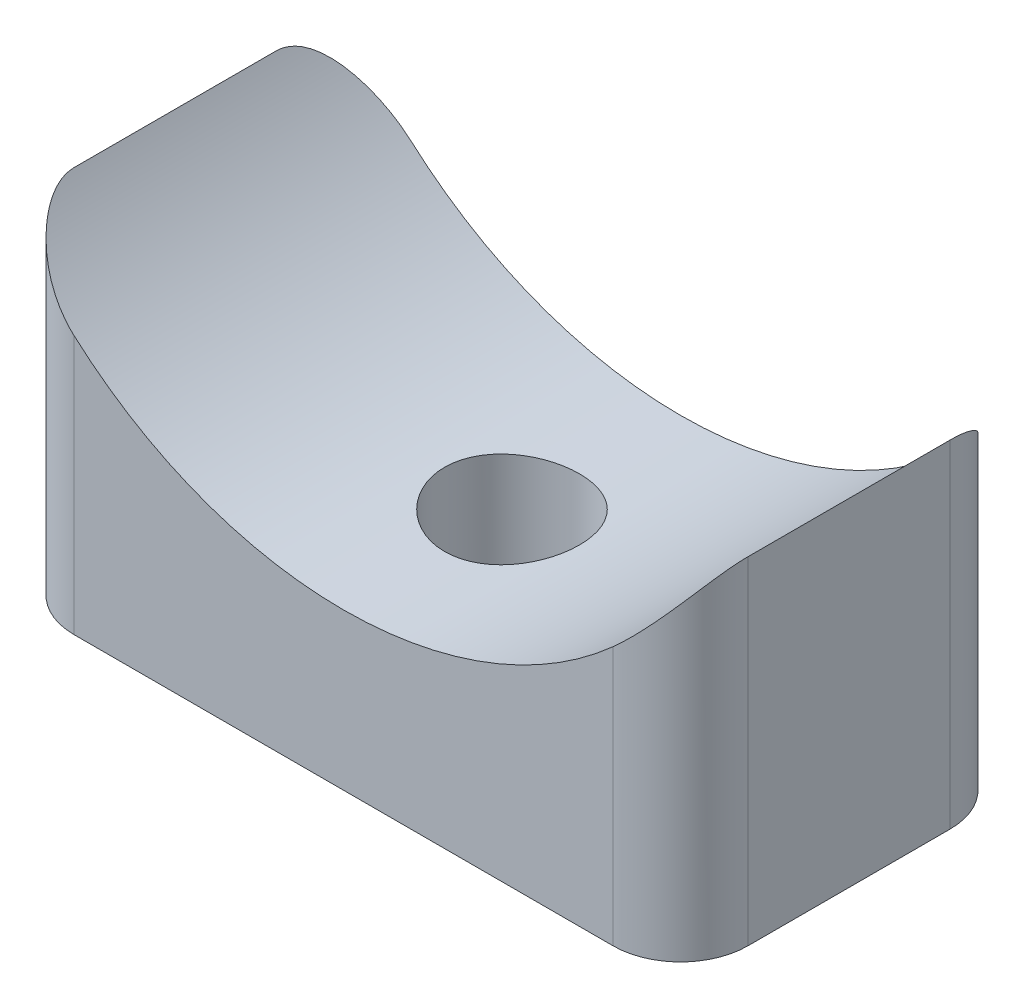
ISO-10303-21;
HEADER;
FILE_DESCRIPTION(('STEP AP214'),'2;1');
FILE_NAME('part.step','',(''),(''),'','','');
FILE_SCHEMA(('AUTOMOTIVE_DESIGN { 1 0 10303 214 1 1 1 1 }'));
ENDSEC;
DATA;
#1=APPLICATION_CONTEXT('core data for automotive mechanical design processes');
#2=APPLICATION_PROTOCOL_DEFINITION('international standard','automotive_design',2000,#1);
#3=PRODUCT_CONTEXT('',#1,'mechanical');
#4=PRODUCT('Part','Part','',(#3));
#5=PRODUCT_RELATED_PRODUCT_CATEGORY('part','',(#4));
#6=PRODUCT_DEFINITION_FORMATION('','',#4);
#7=PRODUCT_DEFINITION_CONTEXT('part definition',#1,'design');
#8=PRODUCT_DEFINITION('design','',#6,#7);
#9=PRODUCT_DEFINITION_SHAPE('','',#8);
#10=(LENGTH_UNIT() NAMED_UNIT(*) SI_UNIT(.MILLI.,.METRE.));
#11=(NAMED_UNIT(*) PLANE_ANGLE_UNIT() SI_UNIT($,.RADIAN.));
#12=(NAMED_UNIT(*) SI_UNIT($,.STERADIAN.) SOLID_ANGLE_UNIT());
#13=UNCERTAINTY_MEASURE_WITH_UNIT(LENGTH_MEASURE(1.E-05),#10,'distance_accuracy_value','');
#14=(GEOMETRIC_REPRESENTATION_CONTEXT(3) GLOBAL_UNCERTAINTY_ASSIGNED_CONTEXT((#13)) GLOBAL_UNIT_ASSIGNED_CONTEXT((#10,
#11,#12)) REPRESENTATION_CONTEXT('',''));
#15=CARTESIAN_POINT('',(0.,0.,0.));
#16=DIRECTION('',(0.,0.,1.));
#17=DIRECTION('',(1.,0.,0.));
#18=AXIS2_PLACEMENT_3D('',#15,#16,#17);
#19=CARTESIAN_POINT('',(10.,16.6332495807108,5.));
#20=DIRECTION('',(0.,0.,-1.));
#21=DIRECTION('',(-1.,0.,0.));
#22=AXIS2_PLACEMENT_3D('',#19,#20,#21);
#23=CYLINDRICAL_SURFACE('',#22,12.);
#24=CARTESIAN_POINT('',(10.,16.6332495807108,-5.));
#25=DIRECTION('',(0.,0.,1.));
#26=DIRECTION('',(1.,0.,0.));
#27=AXIS2_PLACEMENT_3D('',#24,#25,#26);
#28=CIRCLE('',#27,12.);
#29=CARTESIAN_POINT('',(2.,7.68897767071164,-5.));
#30=VERTEX_POINT('',#29);
#31=CARTESIAN_POINT('',(18.,7.68897767071164,-5.));
#32=VERTEX_POINT('',#31);
#33=EDGE_CURVE('E125',#30,#32,#28,.T.);
#34=ORIENTED_EDGE('',*,*,#33,.F.);
#35=CARTESIAN_POINT('',(2.,7.68897767071164,-5.));
#36=CARTESIAN_POINT('',(1.92204510458024,7.75868645106927,-4.99997917822242));
#37=CARTESIAN_POINT('',(1.84505077722787,7.82940191675064,-4.99544345556545));
#38=CARTESIAN_POINT('',(1.69347683524996,7.97227755145943,-4.97784777860481));
#39=CARTESIAN_POINT('',(1.61889603272118,8.04443698058889,-4.96479208680467));
#40=CARTESIAN_POINT('',(1.47186755789119,8.19039386983282,-4.93049860750971));
#41=CARTESIAN_POINT('',(1.39944694093692,8.26420038332054,-4.90918413503015));
#42=CARTESIAN_POINT('',(1.25783085906952,8.41224191582747,-4.85871940650219));
#43=CARTESIAN_POINT('',(1.18863579212429,8.48647698645884,-4.82956818654379));
#44=CARTESIAN_POINT('',(1.05321449198005,8.63542185674512,-4.76332897570576));
#45=CARTESIAN_POINT('',(0.987019224377797,8.71013018735646,-4.72617432063361));
#46=CARTESIAN_POINT('',(0.858561642931568,8.85869188623412,-4.64405982584332));
#47=CARTESIAN_POINT('',(0.796300471448964,8.93254500112933,-4.59909773312028));
#48=CARTESIAN_POINT('',(0.676386358533189,9.07817929079992,-4.50133582039084));
#49=CARTESIAN_POINT('',(0.618715689366292,9.14996767628857,-4.44856865190294));
#50=CARTESIAN_POINT('',(0.508315681273988,9.29050520845288,-4.33460422579772));
#51=CARTESIAN_POINT('',(0.455581486014663,9.35925730618198,-4.27341540271135));
#52=CARTESIAN_POINT('',(0.359678922165779,9.48691568729856,-4.14680631508015));
#53=CARTESIAN_POINT('',(0.316087563711884,9.54617290156917,-4.08206620228683));
#54=CARTESIAN_POINT('',(0.23490736936106,9.6584557601215,-3.94385681181086));
#55=CARTESIAN_POINT('',(0.197316203038635,9.71148382163172,-3.87039094257141));
#56=CARTESIAN_POINT('',(0.135602221832064,9.79979824677033,-3.72733321846744));
#57=CARTESIAN_POINT('',(0.11027653272764,9.83656832122584,-3.65919518648288));
#58=CARTESIAN_POINT('',(0.0664894778290019,9.90072561008608,-3.51676489521075));
#59=CARTESIAN_POINT('',(0.0480004595853315,9.92815058668345,-3.44249894755876));
#60=CARTESIAN_POINT('',(0.0228213116726365,9.96569411581327,-3.30710349566573));
#61=CARTESIAN_POINT('',(0.0143740844759094,9.97837282220845,-3.2470268075222));
#62=CARTESIAN_POINT('',(0.00580822302781559,9.99125020974666,-3.15541820622691));
#63=CARTESIAN_POINT('',(0.0036367271853185,9.9945198825449,-3.12448546214764));
#64=CARTESIAN_POINT('',(0.000730180679332706,9.99889910691122,-3.06237330489779));
#65=CARTESIAN_POINT('',(-3.58597037463007E-06,10.0000067275805,-3.03119369618058));
#66=CARTESIAN_POINT('',(0.,10.,-3.));
#67=B_SPLINE_CURVE_WITH_KNOTS('',3,(#35,#36,#37,#38,#39,#40,#41,#42,#43,#44,#45,#46,#47,#48,#49,
#50,#51,#52,#53,#54,#55,#56,#57,#58,#59,#60,#61,#62,#63,#64,#65,#66),.UNSPECIFIED.,.F.,.F.,(4,2,
2,2,2,2,2,2,2,2,2,2,2,2,2,4),(0.,0.313559302357869,0.626961852499961,0.943346994547067,
1.25977106938429,1.57894039976984,1.89820198689255,2.21616390009485,2.53380965162216,
2.82719398303881,3.12046408764999,3.36402803986124,3.60659577827073,3.79173317186206,
3.88517645406816,3.97870315106009),.UNSPECIFIED.);
#68=CARTESIAN_POINT('',(0.,10.,-3.));
#69=VERTEX_POINT('',#68);
#70=EDGE_CURVE('E107',#30,#69,#67,.T.);
#71=ORIENTED_EDGE('',*,*,#70,.T.);
#72=DIRECTION('',(0.,0.,-1.));
#73=VECTOR('',#72,1.);
#74=CARTESIAN_POINT('',(0.,10.,5.));
#75=LINE('',#74,#73);
#76=CARTESIAN_POINT('',(0.,10.,3.));
#77=VERTEX_POINT('',#76);
#78=EDGE_CURVE('E161',#77,#69,#75,.T.);
#79=ORIENTED_EDGE('',*,*,#78,.F.);
#80=CARTESIAN_POINT('',(0.,10.,3.));
#81=CARTESIAN_POINT('',(-4.77274501777126E-06,10.0000089682609,3.03361012386352));
#82=CARTESIAN_POINT('',(0.000847762427299819,9.99872181038443,3.06720206872265));
#83=CARTESIAN_POINT('',(0.00421949742550781,9.99364217286556,3.13407488350284));
#84=CARTESIAN_POINT('',(0.00673682701038321,9.98985250456692,3.16735606004437));
#85=CARTESIAN_POINT('',(0.0166398074990194,9.97497164198942,3.26566743854851));
#86=CARTESIAN_POINT('',(0.0263789571247845,9.96036417864577,3.32995718350108));
#87=CARTESIAN_POINT('',(0.0545861362410382,9.91837660448694,3.47094020687341));
#88=CARTESIAN_POINT('',(0.0746486923412716,9.88868655934674,3.54660534544344));
#89=CARTESIAN_POINT('',(0.121764469953672,9.81986480680978,3.69142835854605));
#90=CARTESIAN_POINT('',(0.148851091760303,9.78068804952499,3.76055292765346));
#91=CARTESIAN_POINT('',(0.224842251187709,9.67245339006089,3.92808160600015));
#92=CARTESIAN_POINT('',(0.277563114088291,9.59879496513803,4.02173906376068));
#93=CARTESIAN_POINT('',(0.392548559873376,9.44253573990624,4.1945289292063));
#94=CARTESIAN_POINT('',(0.454834503364488,9.35991504953936,4.27362793379137));
#95=CARTESIAN_POINT('',(0.572367710512135,9.20850606197209,4.4027423796056));
#96=CARTESIAN_POINT('',(0.626120281415772,9.14070508930136,4.45531967115386));
#97=CARTESIAN_POINT('',(0.737737440309093,9.00315538087289,4.55312741942334));
#98=CARTESIAN_POINT('',(0.795604160953076,8.93340564647427,4.59835402525909));
#99=CARTESIAN_POINT('',(0.915036621231506,8.79284450140155,4.68171218921222));
#100=CARTESIAN_POINT('',(0.97660279645977,8.72203296644486,4.71984290964752));
#101=CARTESIAN_POINT('',(1.10312689275757,8.58000842188343,4.78908312756059));
#102=CARTESIAN_POINT('',(1.16808483149968,8.50879541018853,4.82019258845003));
#103=CARTESIAN_POINT('',(1.29412073767458,8.37399627899815,4.87240076944587));
#104=CARTESIAN_POINT('',(1.35488984009073,8.3103945348968,4.89420767141069));
#105=CARTESIAN_POINT('',(1.47869858247348,8.18367744517249,4.93195019693017));
#106=CARTESIAN_POINT('',(1.54173781599747,8.12056201491261,4.94788686580628));
#107=CARTESIAN_POINT('',(1.66965702690738,7.99534715548048,4.9736054438867));
#108=CARTESIAN_POINT('',(1.73453059105733,7.93324515510233,4.98340655373327));
#109=CARTESIAN_POINT('',(1.86603263320305,7.81016998882577,4.99659975990954));
#110=CARTESIAN_POINT('',(1.93266195272534,7.74919738899411,4.99998872411412));
#111=CARTESIAN_POINT('',(2.,7.68897767071164,5.));
#112=B_SPLINE_CURVE_WITH_KNOTS('',3,(#80,#81,#82,#83,#84,#85,#86,#87,#88,#89,#90,#91,#92,#93,
#94,#95,#96,#97,#98,#99,#100,#101,#102,#103,#104,#105,#106,#107,#108,#109,#110,#111),
.UNSPECIFIED.,.F.,.F.,(4,2,2,2,2,2,2,2,2,2,2,2,2,2,2,4),(0.,0.100761556823339,0.201410109299858,
0.400366303973839,0.650159620433542,0.901163239521809,1.28989730972732,1.67951247049873,
1.98286822722978,2.28638239760242,2.58993237567264,2.89348393552917,3.16515944935207,
3.43678656208418,3.70755933787016,3.97846434326101),.UNSPECIFIED.);
#113=CARTESIAN_POINT('',(2.,7.68897767071164,5.));
#114=VERTEX_POINT('',#113);
#115=EDGE_CURVE('E119',#77,#114,#112,.T.);
#116=ORIENTED_EDGE('',*,*,#115,.T.);
#117=CARTESIAN_POINT('',(10.,16.6332495807108,5.));
#118=DIRECTION('',(0.,0.,1.));
#119=DIRECTION('',(1.,0.,0.));
#120=AXIS2_PLACEMENT_3D('',#117,#118,#119);
#121=CIRCLE('',#120,12.);
#122=CARTESIAN_POINT('',(18.,7.68897767071164,5.));
#123=VERTEX_POINT('',#122);
#124=EDGE_CURVE('E141',#114,#123,#121,.T.);
#125=ORIENTED_EDGE('',*,*,#124,.T.);
#126=CARTESIAN_POINT('',(18.,7.68897767071164,5.));
#127=CARTESIAN_POINT('',(18.0779548954198,7.75868645106927,4.99997917822242));
#128=CARTESIAN_POINT('',(18.1549492227721,7.82940191675064,4.99544345556545));
#129=CARTESIAN_POINT('',(18.30652316475,7.97227755145943,4.97784777860481));
#130=CARTESIAN_POINT('',(18.3811039672788,8.0444369805889,4.96479208680467));
#131=CARTESIAN_POINT('',(18.5281324421088,8.19039386983282,4.93049860750971));
#132=CARTESIAN_POINT('',(18.6005530590631,8.26420038332054,4.90918413503015));
#133=CARTESIAN_POINT('',(18.7421691409305,8.41224191582748,4.85871940650219));
#134=CARTESIAN_POINT('',(18.8113642078757,8.48647698645884,4.82956818654379));
#135=CARTESIAN_POINT('',(18.9467855080199,8.63542185674512,4.76332897570576));
#136=CARTESIAN_POINT('',(19.0129807756222,8.71013018735646,4.72617432063361));
#137=CARTESIAN_POINT('',(19.1414383570684,8.85869188623412,4.64405982584332));
#138=CARTESIAN_POINT('',(19.203699528551,8.93254500112933,4.59909773312028));
#139=CARTESIAN_POINT('',(19.3236136414668,9.07817929079993,4.50133582039084));
#140=CARTESIAN_POINT('',(19.3812843106337,9.14996767628858,4.44856865190294));
#141=CARTESIAN_POINT('',(19.491684318726,9.29050520845288,4.33460422579772));
#142=CARTESIAN_POINT('',(19.5444185139853,9.35925730618198,4.27341540271135));
#143=CARTESIAN_POINT('',(19.6403210778342,9.48691568729856,4.14680631508015));
#144=CARTESIAN_POINT('',(19.6839124362881,9.54617290156917,4.08206620228682));
#145=CARTESIAN_POINT('',(19.7650926306389,9.6584557601215,3.94385681181086));
#146=CARTESIAN_POINT('',(19.8026837969614,9.71148382163173,3.8703909425714));
#147=CARTESIAN_POINT('',(19.8643977781679,9.79979824677034,3.72733321846744));
#148=CARTESIAN_POINT('',(19.8897234672724,9.83656832122584,3.65919518648288));
#149=CARTESIAN_POINT('',(19.933510522171,9.90072561008608,3.51676489521075));
#150=CARTESIAN_POINT('',(19.9519995404147,9.92815058668346,3.44249894755877));
#151=CARTESIAN_POINT('',(19.9771786883274,9.96569411581328,3.30710349566574));
#152=CARTESIAN_POINT('',(19.9856259155241,9.97837282220845,3.2470268075222));
#153=CARTESIAN_POINT('',(19.9941917769722,9.99125020974667,3.15541820622691));
#154=CARTESIAN_POINT('',(19.9963632728147,9.9945198825449,3.12448546214764));
#155=CARTESIAN_POINT('',(19.9992698193207,9.99889910691122,3.06237330489779));
#156=CARTESIAN_POINT('',(20.0000035859704,10.0000067275805,3.03119369618058));
#157=CARTESIAN_POINT('',(20.,10.,3.));
#158=B_SPLINE_CURVE_WITH_KNOTS('',3,(#126,#127,#128,#129,#130,#131,#132,#133,#134,#135,#136,
#137,#138,#139,#140,#141,#142,#143,#144,#145,#146,#147,#148,#149,#150,#151,#152,#153,#154,#155,
#156,#157),.UNSPECIFIED.,.F.,.F.,(4,2,2,2,2,2,2,2,2,2,2,2,2,2,2,4),(0.,0.313559302357867,
0.626961852499961,0.943346994547069,1.25977106938429,1.57894039976985,1.89820198689256,
2.21616390009485,2.53380965162216,2.82719398303881,3.12046408764999,3.36402803986125,
3.60659577827073,3.79173317186207,3.88517645406816,3.97870315106009),.UNSPECIFIED.);
#159=CARTESIAN_POINT('',(20.,10.,3.));
#160=VERTEX_POINT('',#159);
#161=EDGE_CURVE('E130',#123,#160,#158,.T.);
#162=ORIENTED_EDGE('',*,*,#161,.T.);
#163=DIRECTION('',(0.,0.,-1.));
#164=VECTOR('',#163,1.);
#165=CARTESIAN_POINT('',(20.,10.,5.));
#166=LINE('',#165,#164);
#167=CARTESIAN_POINT('',(20.,10.,-3.));
#168=VERTEX_POINT('',#167);
#169=EDGE_CURVE('E158',#160,#168,#166,.T.);
#170=ORIENTED_EDGE('',*,*,#169,.T.);
#171=CARTESIAN_POINT('',(20.,10.,-3.));
#172=CARTESIAN_POINT('',(20.000004772745,10.0000089682609,-3.03361012386352));
#173=CARTESIAN_POINT('',(19.9991522375727,9.99872181038443,-3.06720206872265));
#174=CARTESIAN_POINT('',(19.9957805025745,9.99364217286557,-3.13407488350284));
#175=CARTESIAN_POINT('',(19.9932631729896,9.98985250456692,-3.16735606004437));
#176=CARTESIAN_POINT('',(19.983360192501,9.97497164198942,-3.26566743854851));
#177=CARTESIAN_POINT('',(19.9736210428752,9.96036417864577,-3.32995718350108));
#178=CARTESIAN_POINT('',(19.945413863759,9.91837660448694,-3.47094020687341));
#179=CARTESIAN_POINT('',(19.9253513076587,9.88868655934674,-3.54660534544344));
#180=CARTESIAN_POINT('',(19.8782355300463,9.81986480680978,-3.69142835854605));
#181=CARTESIAN_POINT('',(19.8511489082397,9.78068804952499,-3.76055292765346));
#182=CARTESIAN_POINT('',(19.7751577488123,9.67245339006089,-3.92808160600015));
#183=CARTESIAN_POINT('',(19.7224368859117,9.59879496513803,-4.02173906376068));
#184=CARTESIAN_POINT('',(19.6074514401266,9.44253573990624,-4.1945289292063));
#185=CARTESIAN_POINT('',(19.5451654966355,9.35991504953936,-4.27362793379137));
#186=CARTESIAN_POINT('',(19.4276322894879,9.20850606197209,-4.4027423796056));
#187=CARTESIAN_POINT('',(19.3738797185842,9.14070508930137,-4.45531967115386));
#188=CARTESIAN_POINT('',(19.2622625596909,9.00315538087289,-4.55312741942334));
#189=CARTESIAN_POINT('',(19.2043958390469,8.93340564647427,-4.59835402525909));
#190=CARTESIAN_POINT('',(19.0849633787685,8.79284450140155,-4.68171218921222));
#191=CARTESIAN_POINT('',(19.0233972035402,8.72203296644486,-4.71984290964752));
#192=CARTESIAN_POINT('',(18.8968731072424,8.58000842188343,-4.78908312756059));
#193=CARTESIAN_POINT('',(18.8319151685003,8.50879541018854,-4.82019258845003));
#194=CARTESIAN_POINT('',(18.7058792623254,8.37399627899815,-4.87240076944587));
#195=CARTESIAN_POINT('',(18.6451101599093,8.3103945348968,-4.89420767141069));
#196=CARTESIAN_POINT('',(18.5213014175265,8.18367744517249,-4.93195019693017));
#197=CARTESIAN_POINT('',(18.4582621840025,8.12056201491261,-4.94788686580628));
#198=CARTESIAN_POINT('',(18.3303429730926,7.99534715548048,-4.9736054438867));
#199=CARTESIAN_POINT('',(18.2654694089427,7.93324515510233,-4.98340655373327));
#200=CARTESIAN_POINT('',(18.133967366797,7.81016998882577,-4.99659975990954));
#201=CARTESIAN_POINT('',(18.0673380472747,7.74919738899411,-4.99998872411412));
#202=CARTESIAN_POINT('',(18.,7.68897767071164,-5.));
#203=B_SPLINE_CURVE_WITH_KNOTS('',3,(#171,#172,#173,#174,#175,#176,#177,#178,#179,#180,#181,
#182,#183,#184,#185,#186,#187,#188,#189,#190,#191,#192,#193,#194,#195,#196,#197,#198,#199,#200,
#201,#202),.UNSPECIFIED.,.F.,.F.,(4,2,2,2,2,2,2,2,2,2,2,2,2,2,2,4),(0.,0.10076155682334,
0.201410109299859,0.40036630397384,0.650159620433544,0.90116323952181,1.28989730972732,
1.67951247049873,1.98286822722978,2.28638239760242,2.58993237567264,2.89348393552917,
3.16515944935207,3.43678656208418,3.70755933787016,3.97846434326101),.UNSPECIFIED.);
#204=EDGE_CURVE('E135',#168,#32,#203,.T.);
#205=ORIENTED_EDGE('',*,*,#204,.T.);
#206=EDGE_LOOP('',(#34,#71,#79,#116,#125,#162,#170,#205));
#207=FACE_BOUND('',#206,.T.);
#208=CARTESIAN_POINT('',(10.,4.6332495807108,-2.));
#209=CARTESIAN_POINT('',(10.1115127239666,4.63325149136021,-1.99999552884175));
#210=CARTESIAN_POINT('',(10.2230863054711,4.63482015740653,-1.99064218002486));
#211=CARTESIAN_POINT('',(10.4431041773384,4.6409268211797,-1.95349147298774));
#212=CARTESIAN_POINT('',(10.5515454943674,4.64546754931968,-1.92567715447072));
#213=CARTESIAN_POINT('',(10.7620837977701,4.6570090348192,-1.8524676411258));
#214=CARTESIAN_POINT('',(10.8641858947455,4.66400777943725,-1.80708682748754));
#215=CARTESIAN_POINT('',(11.0593134735824,4.67969576405424,-1.70007016635808));
#216=CARTESIAN_POINT('',(11.1523399919029,4.68838481067533,-1.6384361780136));
#217=CARTESIAN_POINT('',(11.3275780914333,4.7065830410443,-1.50003593294363));
#218=CARTESIAN_POINT('',(11.409690322828,4.71609860619195,-1.4231447082911));
#219=CARTESIAN_POINT('',(11.5599107989279,4.73482856569694,-1.25668162522175));
#220=CARTESIAN_POINT('',(11.6280181595128,4.74404294100946,-1.16710896683471));
#221=CARTESIAN_POINT('',(11.7486937004841,4.76118905463255,-0.977143227042355));
#222=CARTESIAN_POINT('',(11.8011636422888,4.76911254797771,-0.876686930556195));
#223=CARTESIAN_POINT('',(11.888446692329,4.7826912623534,-0.668232348559499));
#224=CARTESIAN_POINT('',(11.9232609932525,4.78834663659634,-0.560234573057895));
#225=CARTESIAN_POINT('',(11.9739315022278,4.79668528596876,-0.340815780114769));
#226=CARTESIAN_POINT('',(11.9899592233083,4.7993954328252,-0.229435410798887));
#227=CARTESIAN_POINT('',(12.0031333802319,4.8016180692176,-0.00553577849322317));
#228=CARTESIAN_POINT('',(12.0002811523112,4.80113078505309,0.106983403333839));
#229=CARTESIAN_POINT('',(11.9759160787169,4.79703814980236,0.328742289020359));
#230=CARTESIAN_POINT('',(11.9545959055118,4.79346499415947,0.438003842836186));
#231=CARTESIAN_POINT('',(11.8942025123228,4.78365361902274,0.651377054263307));
#232=CARTESIAN_POINT('',(11.8551286834558,4.77741530812463,0.755488535110837));
#233=CARTESIAN_POINT('',(11.7601417968751,4.762941746038,0.956183058752735));
#234=CARTESIAN_POINT('',(11.7041487311038,4.7546970438522,1.05272752486498));
#235=CARTESIAN_POINT('',(11.5769696140459,4.73714623339073,1.23512352043071));
#236=CARTESIAN_POINT('',(11.5057823365234,4.72784003947651,1.32097418596395));
#237=CARTESIAN_POINT('',(11.3491857697272,4.70907335767252,1.48066086864588));
#238=CARTESIAN_POINT('',(11.2636111710985,4.69961238685759,1.55433481483207));
#239=CARTESIAN_POINT('',(11.0812281991853,4.68170876953701,1.68630221013227));
#240=CARTESIAN_POINT('',(10.9844197535251,4.67326612959284,1.74459556014658));
#241=CARTESIAN_POINT('',(10.7821647329334,4.6583384375675,1.84416178170903));
#242=CARTESIAN_POINT('',(10.6767109804517,4.65185503345123,1.885420335465));
#243=CARTESIAN_POINT('',(10.4602386764822,4.64158955660953,1.94959537219678));
#244=CARTESIAN_POINT('',(10.3492205913436,4.63780725790701,1.97251338957897));
#245=CARTESIAN_POINT('',(10.1261679210413,4.63340054196931,1.99913708676891));
#246=CARTESIAN_POINT('',(10.0141605897208,4.63273955660852,2.00306525744448));
#247=CARTESIAN_POINT('',(9.79108818168809,4.63454978534144,1.9921909244575));
#248=CARTESIAN_POINT('',(9.68002306888637,4.63702087891785,1.97738914149301));
#249=CARTESIAN_POINT('',(9.46267505956259,4.64479496520518,1.92966012053162));
#250=CARTESIAN_POINT('',(9.3563673052917,4.65008074230031,1.8968430332879));
#251=CARTESIAN_POINT('',(9.15076249211165,4.66289386506793,1.81413238544037));
#252=CARTESIAN_POINT('',(9.05146582727223,4.67042133661464,1.76423786589178));
#253=CARTESIAN_POINT('',(8.86173544842483,4.68697345029154,1.64827910024257));
#254=CARTESIAN_POINT('',(8.77138779925028,4.69601073361462,1.5820758750662));
#255=CARTESIAN_POINT('',(8.60300513159785,4.71454184157559,1.43557014769195));
#256=CARTESIAN_POINT('',(8.52497100824274,4.72403569933843,1.35526662137867));
#257=CARTESIAN_POINT('',(8.3826057762736,4.74252817882403,1.18184196154286));
#258=CARTESIAN_POINT('',(8.31842499110903,4.75152065161395,1.08859666758847));
#259=CARTESIAN_POINT('',(8.20663815176401,4.76787734248773,0.89251762468917));
#260=CARTESIAN_POINT('',(8.15903157218414,4.77524161218264,0.789684179818004));
#261=CARTESIAN_POINT('',(8.08196933482148,4.78746195112916,0.577768213750295));
#262=CARTESIAN_POINT('',(8.05243885396164,4.79232834622229,0.46871352397561));
#263=CARTESIAN_POINT('',(8.01213163697738,4.79902784602871,0.247103896622591));
#264=CARTESIAN_POINT('',(8.00135327044307,4.80086121444902,0.134549264214359));
#265=CARTESIAN_POINT('',(7.99890170716212,4.80127571603871,-0.0893641327699269));
#266=CARTESIAN_POINT('',(8.00699189109985,4.7998971286656,-0.20072030286023));
#267=CARTESIAN_POINT('',(8.04153612883452,4.79413132908098,-0.420463398440612));
#268=CARTESIAN_POINT('',(8.06799012311002,4.78974412662109,-0.528850333553497));
#269=CARTESIAN_POINT('',(8.13842040832408,4.77847073045705,-0.739486749834091));
#270=CARTESIAN_POINT('',(8.18237632751965,4.77158744295344,-0.841743208044819));
#271=CARTESIAN_POINT('',(8.28653839686728,4.75609462933314,-1.03746853535588));
#272=CARTESIAN_POINT('',(8.34674535300115,4.74748501760361,-1.13093696829771));
#273=CARTESIAN_POINT('',(8.48254489250228,4.72938194834583,-1.3076284664862));
#274=CARTESIAN_POINT('',(8.55831154912508,4.71987921610038,-1.39071681336022));
#275=CARTESIAN_POINT('',(8.72271277489582,4.70113460182407,-1.54308128357995));
#276=CARTESIAN_POINT('',(8.81135030966989,4.69189278049843,-1.61235421491054));
#277=CARTESIAN_POINT('',(8.99970466428777,4.67463734357304,-1.73555861455996));
#278=CARTESIAN_POINT('',(9.09949376997375,4.66663265068596,-1.78938083145036));
#279=CARTESIAN_POINT('',(9.30678954449682,4.65284023989659,-1.87941558768794));
#280=CARTESIAN_POINT('',(9.41428840413599,4.64705031529095,-1.91564566486376));
#281=CARTESIAN_POINT('',(9.60183735196368,4.63960325404716,-1.96160421930133));
#282=CARTESIAN_POINT('',(9.68075293576124,4.63723336252393,-1.97597957569277));
#283=CARTESIAN_POINT('',(9.83976855174415,4.63405585282183,-1.9951789902758));
#284=CARTESIAN_POINT('',(9.91986856351321,4.63324820774567,-2.00000321290989));
#285=CARTESIAN_POINT('',(10.,4.6332495807108,-2.));
#286=B_SPLINE_CURVE_WITH_KNOTS('',3,(#208,#209,#210,#211,#212,#213,#214,#215,#216,#217,#218,
#219,#220,#221,#222,#223,#224,#225,#226,#227,#228,#229,#230,#231,#232,#233,#234,#235,#236,#237,
#238,#239,#240,#241,#242,#243,#244,#245,#246,#247,#248,#249,#250,#251,#252,#253,#254,#255,#256,
#257,#258,#259,#260,#261,#262,#263,#264,#265,#266,#267,#268,#269,#270,#271,#272,#273,#274,#275,
#276,#277,#278,#279,#280,#281,#282,#283,#284,#285),.UNSPECIFIED.,.T.,.F.,(4,2,2,2,2,2,2,2,2,2,2,
2,2,2,2,2,2,2,2,2,2,2,2,2,2,2,2,2,2,2,2,2,2,2,2,2,2,2,4),(0.,0.334245267950807,
0.668798036556336,1.00307749362022,1.33731873013983,1.67441992849866,2.01154240135885,
2.35074016659072,2.68991501500945,3.02596861682739,3.36199843456709,3.69456417408327,
4.02714132020305,4.36131645306046,4.69551856544459,5.03386215929061,5.37220793308678,
5.71083751132723,6.04943875616919,6.38406306793117,6.71867450428687,7.05126245605132,
7.38386908660853,7.71941460501619,8.05498450443426,8.39403057606095,8.73306589900754,
9.07068817873417,9.40828110229294,9.7416632761816,10.0750443695051,10.4080385458098,
10.7410492402347,11.0780110735471,11.4150506710318,11.7544178528576,12.0934460170406,
12.3336339853121,12.5738178182157),.UNSPECIFIED.);
#287=CARTESIAN_POINT('',(10.,4.6332495807108,-2.));
#288=VERTEX_POINT('',#287);
#289=EDGE_CURVE('E137',#288,#288,#286,.T.);
#290=ORIENTED_EDGE('',*,*,#289,.T.);
#291=EDGE_LOOP('',(#290));
#292=FACE_BOUND('',#291,.T.);
#293=ADVANCED_FACE('F38',(#207,#292),#23,.F.);
#294=CARTESIAN_POINT('',(0.,0.,5.));
#295=DIRECTION('',(-1.,0.,0.));
#296=DIRECTION('',(0.,0.,1.));
#297=AXIS2_PLACEMENT_3D('',#294,#295,#296);
#298=PLANE('',#297);
#299=ORIENTED_EDGE('',*,*,#78,.T.);
#300=DIRECTION('',(0.,1.,0.));
#301=VECTOR('',#300,1.);
#302=CARTESIAN_POINT('',(0.,0.,-3.));
#303=LINE('',#302,#301);
#304=CARTESIAN_POINT('',(0.,0.,-3.));
#305=VERTEX_POINT('',#304);
#306=EDGE_CURVE('E112',#69,#305,#303,.F.);
#307=ORIENTED_EDGE('',*,*,#306,.T.);
#308=DIRECTION('',(0.,0.,-1.));
#309=VECTOR('',#308,1.);
#310=CARTESIAN_POINT('',(0.,0.,5.));
#311=LINE('',#310,#309);
#312=CARTESIAN_POINT('',(0.,0.,3.));
#313=VERTEX_POINT('',#312);
#314=EDGE_CURVE('E150',#313,#305,#311,.T.);
#315=ORIENTED_EDGE('',*,*,#314,.F.);
#316=DIRECTION('',(0.,1.,0.));
#317=VECTOR('',#316,1.);
#318=CARTESIAN_POINT('',(0.,0.,3.));
#319=LINE('',#318,#317);
#320=EDGE_CURVE('E118',#313,#77,#319,.T.);
#321=ORIENTED_EDGE('',*,*,#320,.T.);
#322=EDGE_LOOP('',(#299,#307,#315,#321));
#323=FACE_BOUND('',#322,.T.);
#324=ADVANCED_FACE('F185',(#323),#298,.T.);
#325=CARTESIAN_POINT('',(0.,0.,5.));
#326=DIRECTION('',(0.,1.,0.));
#327=DIRECTION('',(0.,0.,1.));
#328=AXIS2_PLACEMENT_3D('',#325,#326,#327);
#329=PLANE('',#328);
#330=CARTESIAN_POINT('',(10.,0.,0.));
#331=DIRECTION('',(0.,1.,0.));
#332=DIRECTION('',(0.,0.,1.));
#333=AXIS2_PLACEMENT_3D('',#330,#331,#332);
#334=CIRCLE('',#333,2.);
#335=CARTESIAN_POINT('',(10.,0.,2.));
#336=VERTEX_POINT('',#335);
#337=EDGE_CURVE('E144',#336,#336,#334,.T.);
#338=ORIENTED_EDGE('',*,*,#337,.T.);
#339=EDGE_LOOP('',(#338));
#340=FACE_BOUND('',#339,.T.);
#341=ORIENTED_EDGE('',*,*,#314,.T.);
#342=CARTESIAN_POINT('',(2.,0.,-3.));
#343=DIRECTION('',(0.,1.,0.));
#344=DIRECTION('',(0.,0.,1.));
#345=AXIS2_PLACEMENT_3D('',#342,#343,#344);
#346=CIRCLE('',#345,2.);
#347=CARTESIAN_POINT('',(2.,0.,-5.));
#348=VERTEX_POINT('',#347);
#349=EDGE_CURVE('E229',#305,#348,#346,.F.);
#350=ORIENTED_EDGE('',*,*,#349,.T.);
#351=DIRECTION('',(1.,0.,0.));
#352=VECTOR('',#351,1.);
#353=CARTESIAN_POINT('',(0.,0.,-5.));
#354=LINE('',#353,#352);
#355=CARTESIAN_POINT('',(18.,0.,-5.));
#356=VERTEX_POINT('',#355);
#357=EDGE_CURVE('E128',#348,#356,#354,.T.);
#358=ORIENTED_EDGE('',*,*,#357,.T.);
#359=CARTESIAN_POINT('',(18.,0.,-3.));
#360=DIRECTION('',(0.,1.,0.));
#361=DIRECTION('',(0.,0.,1.));
#362=AXIS2_PLACEMENT_3D('',#359,#360,#361);
#363=CIRCLE('',#362,2.);
#364=CARTESIAN_POINT('',(20.,0.,-3.));
#365=VERTEX_POINT('',#364);
#366=EDGE_CURVE('E223',#356,#365,#363,.F.);
#367=ORIENTED_EDGE('',*,*,#366,.T.);
#368=DIRECTION('',(0.,0.,-1.));
#369=VECTOR('',#368,1.);
#370=CARTESIAN_POINT('',(20.,0.,5.));
#371=LINE('',#370,#369);
#372=CARTESIAN_POINT('',(20.,0.,3.));
#373=VERTEX_POINT('',#372);
#374=EDGE_CURVE('E154',#373,#365,#371,.T.);
#375=ORIENTED_EDGE('',*,*,#374,.F.);
#376=CARTESIAN_POINT('',(18.,0.,3.));
#377=DIRECTION('',(0.,1.,0.));
#378=DIRECTION('',(0.,0.,1.));
#379=AXIS2_PLACEMENT_3D('',#376,#377,#378);
#380=CIRCLE('',#379,2.);
#381=CARTESIAN_POINT('',(18.,0.,5.));
#382=VERTEX_POINT('',#381);
#383=EDGE_CURVE('E55',#373,#382,#380,.F.);
#384=ORIENTED_EDGE('',*,*,#383,.T.);
#385=DIRECTION('',(1.,0.,0.));
#386=VECTOR('',#385,1.);
#387=CARTESIAN_POINT('',(0.,0.,5.));
#388=LINE('',#387,#386);
#389=CARTESIAN_POINT('',(2.,0.,5.));
#390=VERTEX_POINT('',#389);
#391=EDGE_CURVE('E147',#390,#382,#388,.T.);
#392=ORIENTED_EDGE('',*,*,#391,.F.);
#393=CARTESIAN_POINT('',(2.,0.,3.));
#394=DIRECTION('',(0.,1.,0.));
#395=DIRECTION('',(0.,0.,1.));
#396=AXIS2_PLACEMENT_3D('',#393,#394,#395);
#397=CIRCLE('',#396,2.);
#398=EDGE_CURVE('E226',#390,#313,#397,.F.);
#399=ORIENTED_EDGE('',*,*,#398,.T.);
#400=EDGE_LOOP('',(#341,#350,#358,#367,#375,#384,#392,#399));
#401=FACE_BOUND('',#400,.T.);
#402=ADVANCED_FACE('F183',(#340,#401),#329,.F.);
#403=CARTESIAN_POINT('',(20.,0.,5.));
#404=DIRECTION('',(-1.,0.,0.));
#405=DIRECTION('',(0.,0.,1.));
#406=AXIS2_PLACEMENT_3D('',#403,#404,#405);
#407=PLANE('',#406);
#408=ORIENTED_EDGE('',*,*,#374,.T.);
#409=DIRECTION('',(0.,1.,0.));
#410=VECTOR('',#409,1.);
#411=CARTESIAN_POINT('',(20.,0.,-3.));
#412=LINE('',#411,#410);
#413=EDGE_CURVE('E11',#365,#168,#412,.T.);
#414=ORIENTED_EDGE('',*,*,#413,.T.);
#415=ORIENTED_EDGE('',*,*,#169,.F.);
#416=DIRECTION('',(0.,1.,0.));
#417=VECTOR('',#416,1.);
#418=CARTESIAN_POINT('',(20.,0.,3.));
#419=LINE('',#418,#417);
#420=EDGE_CURVE('E48',#160,#373,#419,.F.);
#421=ORIENTED_EDGE('',*,*,#420,.T.);
#422=EDGE_LOOP('',(#408,#414,#415,#421));
#423=FACE_BOUND('',#422,.T.);
#424=ADVANCED_FACE('F180',(#423),#407,.F.);
#425=CARTESIAN_POINT('',(10.,16.6332495807108,5.));
#426=DIRECTION('',(0.,0.,1.));
#427=DIRECTION('',(1.,0.,0.));
#428=AXIS2_PLACEMENT_3D('',#425,#426,#427);
#429=PLANE('',#428);
#430=ORIENTED_EDGE('',*,*,#124,.F.);
#431=DIRECTION('',(0.,1.,0.));
#432=VECTOR('',#431,1.);
#433=CARTESIAN_POINT('',(2.,16.6332495807108,5.));
#434=LINE('',#433,#432);
#435=EDGE_CURVE('E62',#114,#390,#434,.F.);
#436=ORIENTED_EDGE('',*,*,#435,.T.);
#437=ORIENTED_EDGE('',*,*,#391,.T.);
#438=DIRECTION('',(0.,1.,0.));
#439=VECTOR('',#438,1.);
#440=CARTESIAN_POINT('',(18.,10.,5.));
#441=LINE('',#440,#439);
#442=EDGE_CURVE('E232',#382,#123,#441,.T.);
#443=ORIENTED_EDGE('',*,*,#442,.T.);
#444=EDGE_LOOP('',(#430,#436,#437,#443));
#445=FACE_BOUND('',#444,.T.);
#446=ADVANCED_FACE('F177',(#445),#429,.T.);
#447=CARTESIAN_POINT('',(10.,16.6332495807108,-5.));
#448=DIRECTION('',(0.,0.,1.));
#449=DIRECTION('',(1.,0.,0.));
#450=AXIS2_PLACEMENT_3D('',#447,#448,#449);
#451=PLANE('',#450);
#452=ORIENTED_EDGE('',*,*,#357,.F.);
#453=DIRECTION('',(0.,1.,0.));
#454=VECTOR('',#453,1.);
#455=CARTESIAN_POINT('',(2.,10.,-5.));
#456=LINE('',#455,#454);
#457=EDGE_CURVE('E111',#348,#30,#456,.T.);
#458=ORIENTED_EDGE('',*,*,#457,.T.);
#459=ORIENTED_EDGE('',*,*,#33,.T.);
#460=DIRECTION('',(0.,1.,0.));
#461=VECTOR('',#460,1.);
#462=CARTESIAN_POINT('',(18.,16.6332495807108,-5.));
#463=LINE('',#462,#461);
#464=EDGE_CURVE('E131',#32,#356,#463,.F.);
#465=ORIENTED_EDGE('',*,*,#464,.T.);
#466=EDGE_LOOP('',(#452,#458,#459,#465));
#467=FACE_BOUND('',#466,.T.);
#468=ADVANCED_FACE('F124',(#467),#451,.F.);
#469=CARTESIAN_POINT('',(10.,15.,0.));
#470=DIRECTION('',(0.,-1.,0.));
#471=DIRECTION('',(0.,0.,-1.));
#472=AXIS2_PLACEMENT_3D('',#469,#470,#471);
#473=CYLINDRICAL_SURFACE('',#472,2.);
#474=ORIENTED_EDGE('',*,*,#289,.F.);
#475=EDGE_LOOP('',(#474));
#476=FACE_BOUND('',#475,.T.);
#477=ORIENTED_EDGE('',*,*,#337,.F.);
#478=EDGE_LOOP('',(#477));
#479=FACE_BOUND('',#478,.T.);
#480=ADVANCED_FACE('F172',(#476,#479),#473,.F.);
#481=CARTESIAN_POINT('',(2.,16.6332495807108,-3.));
#482=DIRECTION('',(0.,-1.,0.));
#483=DIRECTION('',(0.,0.,-1.));
#484=AXIS2_PLACEMENT_3D('',#481,#482,#483);
#485=CYLINDRICAL_SURFACE('',#484,2.);
#486=ORIENTED_EDGE('',*,*,#349,.F.);
#487=ORIENTED_EDGE('',*,*,#306,.F.);
#488=ORIENTED_EDGE('',*,*,#70,.F.);
#489=ORIENTED_EDGE('',*,*,#457,.F.);
#490=EDGE_LOOP('',(#486,#487,#488,#489));
#491=FACE_BOUND('',#490,.T.);
#492=ADVANCED_FACE('F110',(#491),#485,.T.);
#493=CARTESIAN_POINT('',(2.,0.,3.));
#494=DIRECTION('',(0.,1.,0.));
#495=DIRECTION('',(0.,0.,1.));
#496=AXIS2_PLACEMENT_3D('',#493,#494,#495);
#497=CYLINDRICAL_SURFACE('',#496,2.);
#498=ORIENTED_EDGE('',*,*,#398,.F.);
#499=ORIENTED_EDGE('',*,*,#435,.F.);
#500=ORIENTED_EDGE('',*,*,#115,.F.);
#501=ORIENTED_EDGE('',*,*,#320,.F.);
#502=EDGE_LOOP('',(#498,#499,#500,#501));
#503=FACE_BOUND('',#502,.T.);
#504=ADVANCED_FACE('F203',(#503),#497,.T.);
#505=CARTESIAN_POINT('',(18.,0.,-3.));
#506=DIRECTION('',(0.,1.,0.));
#507=DIRECTION('',(0.,0.,1.));
#508=AXIS2_PLACEMENT_3D('',#505,#506,#507);
#509=CYLINDRICAL_SURFACE('',#508,2.);
#510=ORIENTED_EDGE('',*,*,#366,.F.);
#511=ORIENTED_EDGE('',*,*,#464,.F.);
#512=ORIENTED_EDGE('',*,*,#204,.F.);
#513=ORIENTED_EDGE('',*,*,#413,.F.);
#514=EDGE_LOOP('',(#510,#511,#512,#513));
#515=FACE_BOUND('',#514,.T.);
#516=ADVANCED_FACE('F265',(#515),#509,.T.);
#517=CARTESIAN_POINT('',(18.,16.6332495807108,3.));
#518=DIRECTION('',(0.,-1.,0.));
#519=DIRECTION('',(0.,0.,-1.));
#520=AXIS2_PLACEMENT_3D('',#517,#518,#519);
#521=CYLINDRICAL_SURFACE('',#520,2.);
#522=ORIENTED_EDGE('',*,*,#383,.F.);
#523=ORIENTED_EDGE('',*,*,#420,.F.);
#524=ORIENTED_EDGE('',*,*,#161,.F.);
#525=ORIENTED_EDGE('',*,*,#442,.F.);
#526=EDGE_LOOP('',(#522,#523,#524,#525));
#527=FACE_BOUND('',#526,.T.);
#528=ADVANCED_FACE('F40',(#527),#521,.T.);
#529=CLOSED_SHELL('',(#293,#324,#402,#424,#446,#468,#480,#492,#504,#516,#528));
#530=MANIFOLD_SOLID_BREP('B2',#529);
#531=ADVANCED_BREP_SHAPE_REPRESENTATION('',(#18,#530),#14);
#532=SHAPE_DEFINITION_REPRESENTATION(#9,#531);
ENDSEC;
END-ISO-10303-21;
